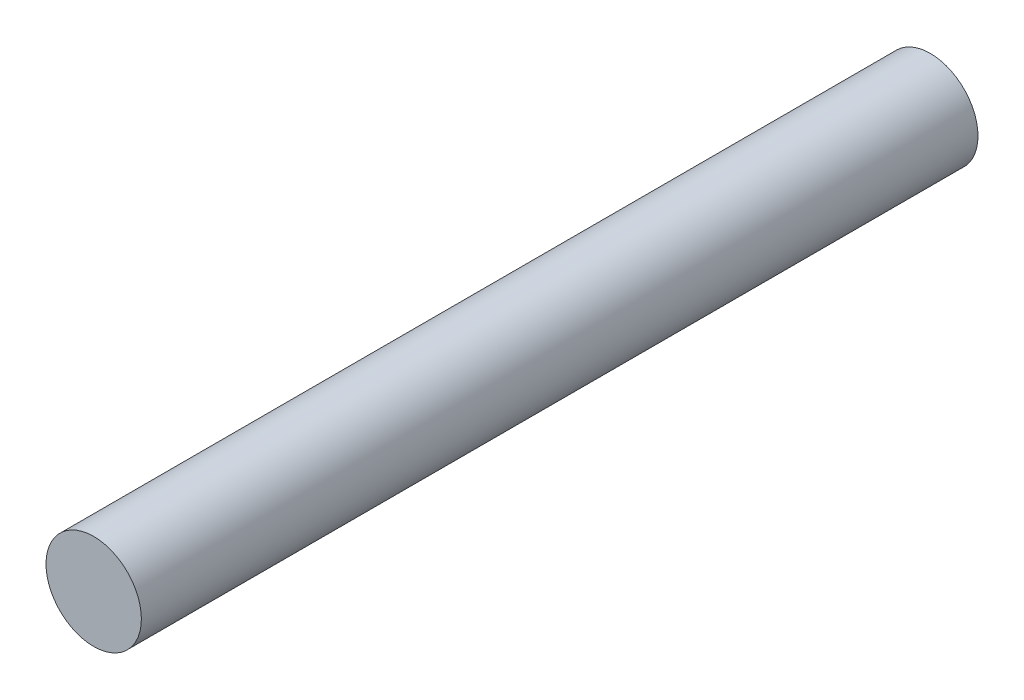
ISO-10303-21;
HEADER;
FILE_DESCRIPTION(('STEP AP214'),'2;1');
FILE_NAME('part.step','',(''),(''),'','','');
FILE_SCHEMA(('AUTOMOTIVE_DESIGN { 1 0 10303 214 1 1 1 1 }'));
ENDSEC;
DATA;
#1=APPLICATION_CONTEXT('core data for automotive mechanical design processes');
#2=APPLICATION_PROTOCOL_DEFINITION('international standard','automotive_design',2000,#1);
#3=PRODUCT_CONTEXT('',#1,'mechanical');
#4=PRODUCT('Part','Part','',(#3));
#5=PRODUCT_RELATED_PRODUCT_CATEGORY('part','',(#4));
#6=PRODUCT_DEFINITION_FORMATION('','',#4);
#7=PRODUCT_DEFINITION_CONTEXT('part definition',#1,'design');
#8=PRODUCT_DEFINITION('design','',#6,#7);
#9=PRODUCT_DEFINITION_SHAPE('','',#8);
#10=(LENGTH_UNIT() NAMED_UNIT(*) SI_UNIT(.MILLI.,.METRE.));
#11=(NAMED_UNIT(*) PLANE_ANGLE_UNIT() SI_UNIT($,.RADIAN.));
#12=(NAMED_UNIT(*) SI_UNIT($,.STERADIAN.) SOLID_ANGLE_UNIT());
#13=UNCERTAINTY_MEASURE_WITH_UNIT(LENGTH_MEASURE(1.E-05),#10,'distance_accuracy_value','');
#14=(GEOMETRIC_REPRESENTATION_CONTEXT(3) GLOBAL_UNCERTAINTY_ASSIGNED_CONTEXT((#13)) GLOBAL_UNIT_ASSIGNED_CONTEXT((#10,
#11,#12)) REPRESENTATION_CONTEXT('',''));
#15=CARTESIAN_POINT('',(0.,0.,0.));
#16=DIRECTION('',(0.,0.,1.));
#17=DIRECTION('',(1.,0.,0.));
#18=AXIS2_PLACEMENT_3D('',#15,#16,#17);
#19=CARTESIAN_POINT('',(0.,0.,19.3002590656188));
#20=DIRECTION('',(0.,0.,1.));
#21=DIRECTION('',(1.,0.,0.));
#22=AXIS2_PLACEMENT_3D('',#19,#20,#21);
#23=PLANE('',#22);
#24=CARTESIAN_POINT('',(0.,0.,19.3002590656188));
#25=DIRECTION('',(0.,0.,-1.));
#26=DIRECTION('',(-1.,0.,0.));
#27=AXIS2_PLACEMENT_3D('',#24,#25,#26);
#28=CIRCLE('',#27,2.2);
#29=CARTESIAN_POINT('',(-2.2,0.,19.3002590656188));
#30=VERTEX_POINT('',#29);
#31=EDGE_CURVE('E9',#30,#30,#28,.T.);
#32=ORIENTED_EDGE('',*,*,#31,.F.);
#33=EDGE_LOOP('',(#32));
#34=FACE_BOUND('',#33,.T.);
#35=ADVANCED_FACE('F14',(#34),#23,.T.);
#36=CARTESIAN_POINT('',(0.,0.,-19.3002590656188));
#37=DIRECTION('',(0.,0.,-1.));
#38=DIRECTION('',(-1.,0.,0.));
#39=AXIS2_PLACEMENT_3D('',#36,#37,#38);
#40=PLANE('',#39);
#41=CARTESIAN_POINT('',(0.,0.,-19.3002590656188));
#42=DIRECTION('',(0.,0.,1.));
#43=DIRECTION('',(1.,0.,0.));
#44=AXIS2_PLACEMENT_3D('',#41,#42,#43);
#45=CIRCLE('',#44,2.2);
#46=CARTESIAN_POINT('',(2.2,0.,-19.3002590656188));
#47=VERTEX_POINT('',#46);
#48=EDGE_CURVE('E21',#47,#47,#45,.T.);
#49=ORIENTED_EDGE('',*,*,#48,.F.);
#50=EDGE_LOOP('',(#49));
#51=FACE_BOUND('',#50,.T.);
#52=ADVANCED_FACE('F29',(#51),#40,.T.);
#53=CARTESIAN_POINT('',(0.,0.,-19.3002590656188));
#54=DIRECTION('',(0.,0.,1.));
#55=DIRECTION('',(1.,0.,0.));
#56=AXIS2_PLACEMENT_3D('',#53,#54,#55);
#57=CYLINDRICAL_SURFACE('',#56,2.2);
#58=ORIENTED_EDGE('',*,*,#31,.T.);
#59=EDGE_LOOP('',(#58));
#60=FACE_BOUND('',#59,.T.);
#61=ORIENTED_EDGE('',*,*,#48,.T.);
#62=EDGE_LOOP('',(#61));
#63=FACE_BOUND('',#62,.T.);
#64=ADVANCED_FACE('F16',(#60,#63),#57,.T.);
#65=CLOSED_SHELL('',(#35,#52,#64));
#66=MANIFOLD_SOLID_BREP('B1',#65);
#67=ADVANCED_BREP_SHAPE_REPRESENTATION('',(#18,#66),#14);
#68=SHAPE_DEFINITION_REPRESENTATION(#9,#67);
ENDSEC;
END-ISO-10303-21;
